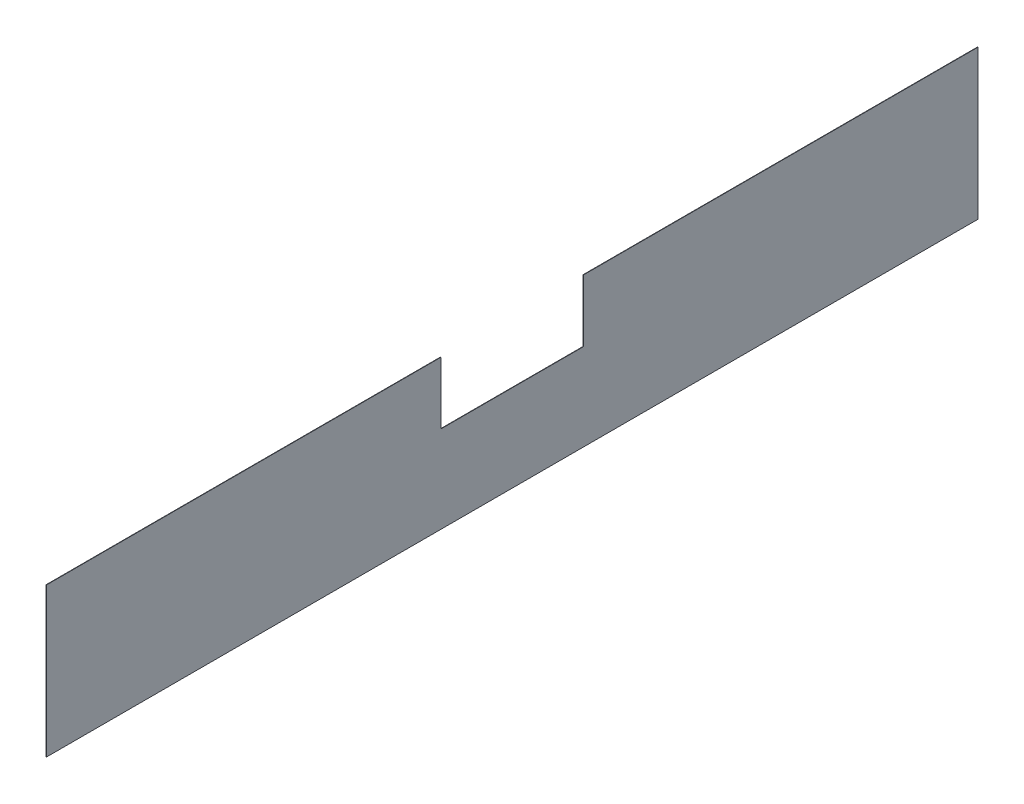
ISO-10303-21;
HEADER;
FILE_DESCRIPTION(('STEP AP214'),'2;1');
FILE_NAME('part.step','',(''),(''),'','','');
FILE_SCHEMA(('AUTOMOTIVE_DESIGN { 1 0 10303 214 1 1 1 1 }'));
ENDSEC;
DATA;
#1=APPLICATION_CONTEXT('core data for automotive mechanical design processes');
#2=APPLICATION_PROTOCOL_DEFINITION('international standard','automotive_design',2000,#1);
#3=PRODUCT_CONTEXT('',#1,'mechanical');
#4=PRODUCT('Part','Part','',(#3));
#5=PRODUCT_RELATED_PRODUCT_CATEGORY('part','',(#4));
#6=PRODUCT_DEFINITION_FORMATION('','',#4);
#7=PRODUCT_DEFINITION_CONTEXT('part definition',#1,'design');
#8=PRODUCT_DEFINITION('design','',#6,#7);
#9=PRODUCT_DEFINITION_SHAPE('','',#8);
#10=(LENGTH_UNIT() NAMED_UNIT(*) SI_UNIT(.MILLI.,.METRE.));
#11=(NAMED_UNIT(*) PLANE_ANGLE_UNIT() SI_UNIT($,.RADIAN.));
#12=(NAMED_UNIT(*) SI_UNIT($,.STERADIAN.) SOLID_ANGLE_UNIT());
#13=UNCERTAINTY_MEASURE_WITH_UNIT(LENGTH_MEASURE(1.E-05),#10,'distance_accuracy_value','');
#14=(GEOMETRIC_REPRESENTATION_CONTEXT(3) GLOBAL_UNCERTAINTY_ASSIGNED_CONTEXT((#13)) GLOBAL_UNIT_ASSIGNED_CONTEXT((#10,
#11,#12)) REPRESENTATION_CONTEXT('',''));
#15=CARTESIAN_POINT('',(0.,0.,0.));
#16=DIRECTION('',(0.,0.,1.));
#17=DIRECTION('',(1.,0.,0.));
#18=AXIS2_PLACEMENT_3D('',#15,#16,#17);
#19=CARTESIAN_POINT('',(-124.111000007025,60.0009999926593,150.000000000021));
#20=DIRECTION('',(-5.9146407453713E-11,1.,0.));
#21=DIRECTION('',(-1.,-5.9146407453713E-11,0.));
#22=AXIS2_PLACEMENT_3D('',#19,#20,#21);
#23=PLANE('',#22);
#24=DIRECTION('',(-1.,-5.9146407457357E-11,-2.36582975430166E-11));
#25=VECTOR('',#24,1.);
#26=CARTESIAN_POINT('',(-114.11100000402,60.0009999932507,22.9999999973003));
#27=LINE('',#26,#25);
#28=CARTESIAN_POINT('',(-123.984000003476,60.0009999926668,22.9999999970667));
#29=VERTEX_POINT('',#28);
#30=CARTESIAN_POINT('',(-124.11100000402,60.0009999926593,22.9999999970637));
#31=VERTEX_POINT('',#30);
#32=EDGE_CURVE('E110',#29,#31,#27,.T.);
#33=ORIENTED_EDGE('',*,*,#32,.T.);
#34=DIRECTION('',(-2.36582975430166E-11,0.,1.));
#35=VECTOR('',#34,1.);
#36=CARTESIAN_POINT('',(-124.111000007025,60.0009999926593,150.000000000021));
#37=LINE('',#36,#35);
#38=CARTESIAN_POINT('',(-124.111000007025,60.0009999926593,150.000000000021));
#39=VERTEX_POINT('',#38);
#40=EDGE_CURVE('E122',#31,#39,#37,.T.);
#41=ORIENTED_EDGE('',*,*,#40,.T.);
#42=DIRECTION('',(1.,5.9146407453713E-11,2.36582975430166E-11));
#43=VECTOR('',#42,1.);
#44=CARTESIAN_POINT('',(-124.111000007025,60.0009999926593,150.000000000021));
#45=LINE('',#44,#43);
#46=CARTESIAN_POINT('',(-123.984000007025,60.0009999926668,150.000000000024));
#47=VERTEX_POINT('',#46);
#48=EDGE_CURVE('E149',#39,#47,#45,.T.);
#49=ORIENTED_EDGE('',*,*,#48,.T.);
#50=DIRECTION('',(-2.36582975430166E-11,0.,1.));
#51=VECTOR('',#50,1.);
#52=CARTESIAN_POINT('',(-123.984000007025,60.0009999926668,150.000000000024));
#53=LINE('',#52,#51);
#54=EDGE_CURVE('E124',#29,#47,#53,.T.);
#55=ORIENTED_EDGE('',*,*,#54,.F.);
#56=EDGE_LOOP('',(#33,#41,#49,#55));
#57=FACE_BOUND('',#56,.T.);
#58=ADVANCED_FACE('F43',(#57),#23,.T.);
#59=CARTESIAN_POINT('',(-124.110999999927,-59.9999999999474,150.000000000021));
#60=DIRECTION('',(-2.36582975430166E-11,0.,1.));
#61=DIRECTION('',(1.,0.,2.36582975430166E-11));
#62=AXIS2_PLACEMENT_3D('',#59,#60,#61);
#63=PLANE('',#62);
#64=DIRECTION('',(-1.,-5.9146407457357E-11,-2.36582975430166E-11));
#65=VECTOR('',#64,1.);
#66=CARTESIAN_POINT('',(-114.111000004186,12.000000000644,149.9999999973));
#67=LINE('',#66,#65);
#68=CARTESIAN_POINT('',(-123.984000002056,12.0000000000601,149.999999997067));
#69=VERTEX_POINT('',#68);
#70=CARTESIAN_POINT('',(-124.111000004186,12.0000000000526,149.999999997064));
#71=VERTEX_POINT('',#70);
#72=EDGE_CURVE('E164',#69,#71,#67,.T.);
#73=ORIENTED_EDGE('',*,*,#72,.F.);
#74=DIRECTION('',(5.9146407457357E-11,-1.,0.));
#75=VECTOR('',#74,1.);
#76=CARTESIAN_POINT('',(-123.983999999927,-59.9999999999399,150.000000000024));
#77=LINE('',#76,#75);
#78=EDGE_CURVE('E141',#47,#69,#77,.T.);
#79=ORIENTED_EDGE('',*,*,#78,.F.);
#80=ORIENTED_EDGE('',*,*,#48,.F.);
#81=DIRECTION('',(5.9146407457357E-11,-1.,0.));
#82=VECTOR('',#81,1.);
#83=CARTESIAN_POINT('',(-124.110999999927,-59.9999999999474,150.000000000021));
#84=LINE('',#83,#82);
#85=EDGE_CURVE('E132',#39,#71,#84,.T.);
#86=ORIENTED_EDGE('',*,*,#85,.T.);
#87=EDGE_LOOP('',(#73,#79,#80,#86));
#88=FACE_BOUND('',#87,.T.);
#89=ADVANCED_FACE('F45',(#88),#63,.T.);
#90=DIRECTION('',(-1.,-5.9146407457357E-11,-2.36582975430166E-11));
#91=VECTOR('',#90,1.);
#92=CARTESIAN_POINT('',(-114.111000002932,60.0009999932507,-23.0000000026997));
#93=LINE('',#92,#91);
#94=CARTESIAN_POINT('',(-123.984000003476,60.0009999926668,-23.0000000029332));
#95=VERTEX_POINT('',#94);
#96=CARTESIAN_POINT('',(-124.111000002932,60.0009999926593,-23.0000000029363));
#97=VERTEX_POINT('',#96);
#98=EDGE_CURVE('E125',#95,#97,#93,.T.);
#99=ORIENTED_EDGE('',*,*,#98,.F.);
#100=CARTESIAN_POINT('',(-123.983999999927,60.0009999926668,-150.000000002933));
#101=VERTEX_POINT('',#100);
#102=EDGE_CURVE('E146',#101,#95,#53,.T.);
#103=ORIENTED_EDGE('',*,*,#102,.F.);
#104=DIRECTION('',(1.,5.9146407453713E-11,2.36582975430166E-11));
#105=VECTOR('',#104,1.);
#106=CARTESIAN_POINT('',(-124.110999999927,60.0009999926593,-150.000000002936));
#107=LINE('',#106,#105);
#108=CARTESIAN_POINT('',(-124.110999999927,60.0009999926593,-150.000000002936));
#109=VERTEX_POINT('',#108);
#110=EDGE_CURVE('E137',#109,#101,#107,.T.);
#111=ORIENTED_EDGE('',*,*,#110,.F.);
#112=EDGE_CURVE('E133',#109,#97,#37,.T.);
#113=ORIENTED_EDGE('',*,*,#112,.T.);
#114=EDGE_LOOP('',(#99,#103,#111,#113));
#115=FACE_BOUND('',#114,.T.);
#116=ADVANCED_FACE('F184',(#115),#23,.T.);
#117=CARTESIAN_POINT('',(-124.11099999283,-59.9999999999474,-150.000000002936));
#118=DIRECTION('',(2.36582975430166E-11,0.,-1.));
#119=DIRECTION('',(-1.,0.,-2.36582975430166E-11));
#120=AXIS2_PLACEMENT_3D('',#117,#118,#119);
#121=PLANE('',#120);
#122=DIRECTION('',(-1.,-5.9146407457357E-11,-2.36582975430166E-11));
#123=VECTOR('',#122,1.);
#124=CARTESIAN_POINT('',(-114.110999997088,12.000000000644,-150.0000000027));
#125=LINE('',#124,#123);
#126=CARTESIAN_POINT('',(-123.983999997088,12.0000000000601,-150.000000002933));
#127=VERTEX_POINT('',#126);
#128=CARTESIAN_POINT('',(-124.110999997088,12.0000000000526,-150.000000002936));
#129=VERTEX_POINT('',#128);
#130=EDGE_CURVE('E66',#127,#129,#125,.T.);
#131=ORIENTED_EDGE('',*,*,#130,.T.);
#132=DIRECTION('',(-5.9146407457357E-11,1.,0.));
#133=VECTOR('',#132,1.);
#134=CARTESIAN_POINT('',(-124.11099999283,-59.9999999999474,-150.000000002936));
#135=LINE('',#134,#133);
#136=EDGE_CURVE('E134',#129,#109,#135,.T.);
#137=ORIENTED_EDGE('',*,*,#136,.T.);
#138=ORIENTED_EDGE('',*,*,#110,.T.);
#139=DIRECTION('',(-5.9146407457357E-11,1.,0.));
#140=VECTOR('',#139,1.);
#141=CARTESIAN_POINT('',(-123.98399999283,-59.9999999999399,-150.000000002933));
#142=LINE('',#141,#140);
#143=EDGE_CURVE('E144',#127,#101,#142,.T.);
#144=ORIENTED_EDGE('',*,*,#143,.F.);
#145=EDGE_LOOP('',(#131,#137,#138,#144));
#146=FACE_BOUND('',#145,.T.);
#147=ADVANCED_FACE('F177',(#146),#121,.T.);
#148=CARTESIAN_POINT('',(-124.110999999927,-7.34071977593526E-09,-2.9362549663596E-09));
#149=DIRECTION('',(-1.,-5.9146407457357E-11,-2.36582975430166E-11));
#150=DIRECTION('',(5.9146407457357E-11,-1.,0.));
#151=AXIS2_PLACEMENT_3D('',#148,#149,#150);
#152=PLANE('',#151);
#153=DIRECTION('',(-5.91464377475149E-11,1.,0.));
#154=VECTOR('',#153,1.);
#155=CARTESIAN_POINT('',(-124.111000002837,40.0009999926593,22.9999999970637));
#156=LINE('',#155,#154);
#157=CARTESIAN_POINT('',(-124.111000002837,40.0009999926593,22.9999999970637));
#158=VERTEX_POINT('',#157);
#159=EDGE_CURVE('E107',#158,#31,#156,.T.);
#160=ORIENTED_EDGE('',*,*,#159,.F.);
#161=DIRECTION('',(-2.36583096108914E-11,0.,1.));
#162=VECTOR('',#161,1.);
#163=CARTESIAN_POINT('',(-124.111000001749,40.0009999926593,-23.0000000029362));
#164=LINE('',#163,#162);
#165=CARTESIAN_POINT('',(-124.111000001749,40.0009999926593,-23.0000000029362));
#166=VERTEX_POINT('',#165);
#167=EDGE_CURVE('E126',#166,#158,#164,.T.);
#168=ORIENTED_EDGE('',*,*,#167,.F.);
#169=DIRECTION('',(5.91464377475148E-11,-1.,0.));
#170=VECTOR('',#169,1.);
#171=CARTESIAN_POINT('',(-124.111000001749,40.0009999926593,-23.0000000029362));
#172=LINE('',#171,#170);
#173=EDGE_CURVE('E117',#97,#166,#172,.T.);
#174=ORIENTED_EDGE('',*,*,#173,.F.);
#175=ORIENTED_EDGE('',*,*,#112,.F.);
#176=ORIENTED_EDGE('',*,*,#136,.F.);
#177=DIRECTION('',(2.36582975432498E-11,0.,-1.));
#178=VECTOR('',#177,1.);
#179=CARTESIAN_POINT('',(-124.110999997088,12.0000000000526,-150.000000002936));
#180=LINE('',#179,#178);
#181=EDGE_CURVE('E162',#71,#129,#180,.T.);
#182=ORIENTED_EDGE('',*,*,#181,.F.);
#183=ORIENTED_EDGE('',*,*,#85,.F.);
#184=ORIENTED_EDGE('',*,*,#40,.F.);
#185=EDGE_LOOP('',(#160,#168,#174,#175,#176,#182,#183,#184));
#186=FACE_BOUND('',#185,.T.);
#187=ADVANCED_FACE('F129',(#186),#152,.T.);
#188=CARTESIAN_POINT('',(-123.983999999927,-7.33320818218863E-09,-2.93325036257164E-09));
#189=DIRECTION('',(-1.,-5.9146407457357E-11,-2.36582975430166E-11));
#190=DIRECTION('',(5.9146407457357E-11,-1.,0.));
#191=AXIS2_PLACEMENT_3D('',#188,#189,#190);
#192=PLANE('',#191);
#193=DIRECTION('',(-2.36582975430166E-11,0.,1.));
#194=VECTOR('',#193,1.);
#195=CARTESIAN_POINT('',(-123.984000002293,40.0009999926668,-2.93326846454251E-09));
#196=LINE('',#195,#194);
#197=CARTESIAN_POINT('',(-123.984000001749,40.0009999926593,-23.0000000029332));
#198=VERTEX_POINT('',#197);
#199=CARTESIAN_POINT('',(-123.984000002293,40.0009999926668,22.9999999970667));
#200=VERTEX_POINT('',#199);
#201=EDGE_CURVE('E51',#198,#200,#196,.T.);
#202=ORIENTED_EDGE('',*,*,#201,.T.);
#203=DIRECTION('',(-5.9146407457357E-11,1.,0.));
#204=VECTOR('',#203,1.);
#205=CARTESIAN_POINT('',(-123.984000000471,-7.33320419235682E-09,22.9999999970667));
#206=LINE('',#205,#204);
#207=EDGE_CURVE('E11',#200,#29,#206,.T.);
#208=ORIENTED_EDGE('',*,*,#207,.T.);
#209=ORIENTED_EDGE('',*,*,#54,.T.);
#210=ORIENTED_EDGE('',*,*,#78,.T.);
#211=DIRECTION('',(2.36582975430166E-11,0.,-1.));
#212=VECTOR('',#211,1.);
#213=CARTESIAN_POINT('',(-123.984000000637,12.0000000000601,-2.93325036258843E-09));
#214=LINE('',#213,#212);
#215=EDGE_CURVE('E151',#69,#127,#214,.T.);
#216=ORIENTED_EDGE('',*,*,#215,.T.);
#217=ORIENTED_EDGE('',*,*,#143,.T.);
#218=ORIENTED_EDGE('',*,*,#102,.T.);
#219=DIRECTION('',(5.9146407457357E-11,-1.,0.));
#220=VECTOR('',#219,1.);
#221=CARTESIAN_POINT('',(-123.983999999383,-7.33321217202044E-09,-23.0000000029332));
#222=LINE('',#221,#220);
#223=EDGE_CURVE('E155',#95,#198,#222,.T.);
#224=ORIENTED_EDGE('',*,*,#223,.T.);
#225=EDGE_LOOP('',(#202,#208,#209,#210,#216,#217,#218,#224));
#226=FACE_BOUND('',#225,.T.);
#227=ADVANCED_FACE('F159',(#226),#192,.F.);
#228=CARTESIAN_POINT('',(-114.110999997088,12.000000000644,-150.0000000027));
#229=DIRECTION('',(-5.9146407457357E-11,1.,0.));
#230=DIRECTION('',(-1.,-5.9146407457357E-11,0.));
#231=AXIS2_PLACEMENT_3D('',#228,#229,#230);
#232=PLANE('',#231);
#233=ORIENTED_EDGE('',*,*,#72,.T.);
#234=ORIENTED_EDGE('',*,*,#181,.T.);
#235=ORIENTED_EDGE('',*,*,#130,.F.);
#236=ORIENTED_EDGE('',*,*,#215,.F.);
#237=EDGE_LOOP('',(#233,#234,#235,#236));
#238=FACE_BOUND('',#237,.T.);
#239=ADVANCED_FACE('F187',(#238),#232,.F.);
#240=CARTESIAN_POINT('',(-114.111000002837,40.0009999932508,22.9999999973003));
#241=DIRECTION('',(-2.36582975430166E-11,0.,1.));
#242=DIRECTION('',(1.,0.,2.36582975430166E-11));
#243=AXIS2_PLACEMENT_3D('',#240,#241,#242);
#244=PLANE('',#243);
#245=DIRECTION('',(-1.,-5.9146407457357E-11,-2.36582975430166E-11));
#246=VECTOR('',#245,1.);
#247=CARTESIAN_POINT('',(-114.111000002837,40.0009999932508,22.9999999973003));
#248=LINE('',#247,#246);
#249=EDGE_CURVE('E112',#200,#158,#248,.T.);
#250=ORIENTED_EDGE('',*,*,#249,.T.);
#251=ORIENTED_EDGE('',*,*,#159,.T.);
#252=ORIENTED_EDGE('',*,*,#32,.F.);
#253=ORIENTED_EDGE('',*,*,#207,.F.);
#254=EDGE_LOOP('',(#250,#251,#252,#253));
#255=FACE_BOUND('',#254,.T.);
#256=ADVANCED_FACE('F109',(#255),#244,.F.);
#257=CARTESIAN_POINT('',(-114.111000001749,40.0009999932507,-23.0000000026997));
#258=DIRECTION('',(5.9146407457357E-11,-1.,0.));
#259=DIRECTION('',(1.,5.9146407457357E-11,0.));
#260=AXIS2_PLACEMENT_3D('',#257,#258,#259);
#261=PLANE('',#260);
#262=DIRECTION('',(-1.,-5.9146407457357E-11,-2.36582975430166E-11));
#263=VECTOR('',#262,1.);
#264=CARTESIAN_POINT('',(-114.111000001749,40.0009999932507,-23.0000000026997));
#265=LINE('',#264,#263);
#266=EDGE_CURVE('E58',#198,#166,#265,.T.);
#267=ORIENTED_EDGE('',*,*,#266,.T.);
#268=ORIENTED_EDGE('',*,*,#167,.T.);
#269=ORIENTED_EDGE('',*,*,#249,.F.);
#270=ORIENTED_EDGE('',*,*,#201,.F.);
#271=EDGE_LOOP('',(#267,#268,#269,#270));
#272=FACE_BOUND('',#271,.T.);
#273=ADVANCED_FACE('F161',(#272),#261,.F.);
#274=CARTESIAN_POINT('',(-114.111000001749,40.0009999932507,-23.0000000026997));
#275=DIRECTION('',(2.36582975430166E-11,0.,-1.));
#276=DIRECTION('',(-1.,0.,-2.36582975430166E-11));
#277=AXIS2_PLACEMENT_3D('',#274,#275,#276);
#278=PLANE('',#277);
#279=ORIENTED_EDGE('',*,*,#98,.T.);
#280=ORIENTED_EDGE('',*,*,#173,.T.);
#281=ORIENTED_EDGE('',*,*,#266,.F.);
#282=ORIENTED_EDGE('',*,*,#223,.F.);
#283=EDGE_LOOP('',(#279,#280,#281,#282));
#284=FACE_BOUND('',#283,.T.);
#285=ADVANCED_FACE('F186',(#284),#278,.F.);
#286=CLOSED_SHELL('',(#58,#89,#116,#147,#187,#227,#239,#256,#273,#285));
#287=MANIFOLD_SOLID_BREP('B2',#286);
#288=ADVANCED_BREP_SHAPE_REPRESENTATION('',(#18,#287),#14);
#289=SHAPE_DEFINITION_REPRESENTATION(#9,#288);
ENDSEC;
END-ISO-10303-21;
